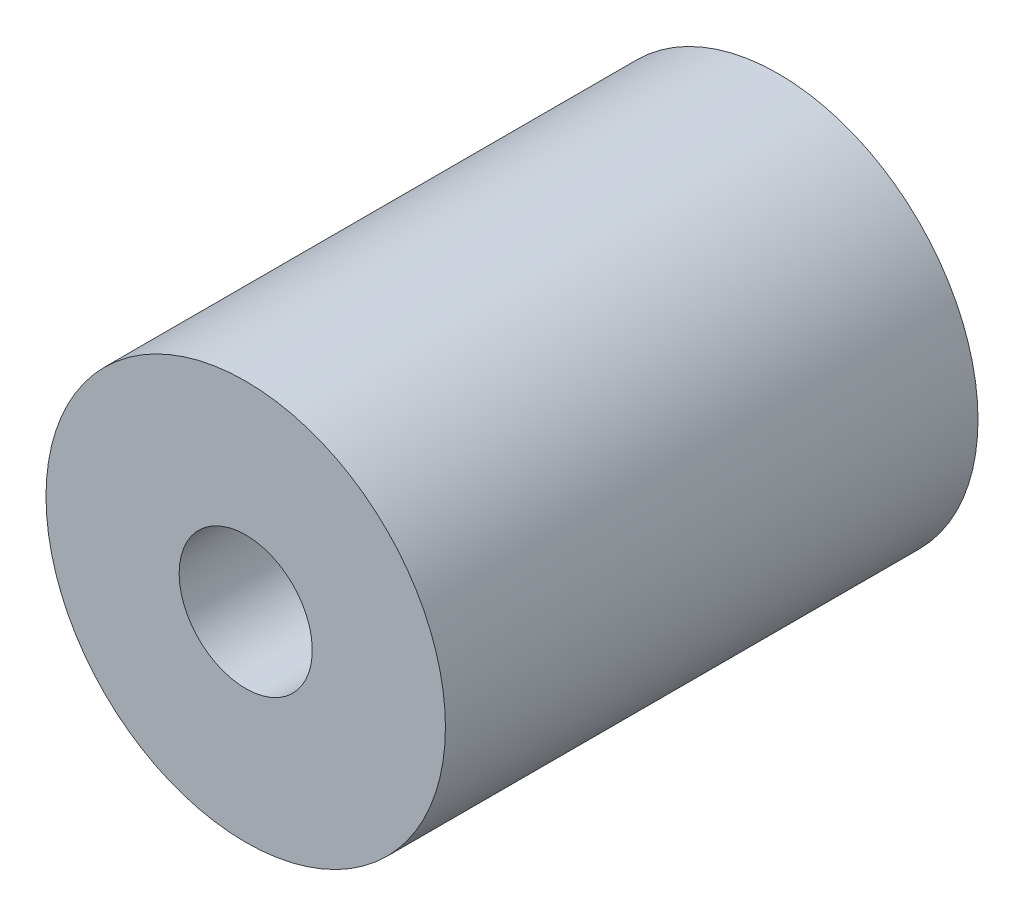
ISO-10303-21;
HEADER;
FILE_DESCRIPTION(('STEP AP214'),'2;1');
FILE_NAME('part.step','',(''),(''),'','','');
FILE_SCHEMA(('AUTOMOTIVE_DESIGN { 1 0 10303 214 1 1 1 1 }'));
ENDSEC;
DATA;
#1=APPLICATION_CONTEXT('core data for automotive mechanical design processes');
#2=APPLICATION_PROTOCOL_DEFINITION('international standard','automotive_design',2000,#1);
#3=PRODUCT_CONTEXT('',#1,'mechanical');
#4=PRODUCT('Part','Part','',(#3));
#5=PRODUCT_RELATED_PRODUCT_CATEGORY('part','',(#4));
#6=PRODUCT_DEFINITION_FORMATION('','',#4);
#7=PRODUCT_DEFINITION_CONTEXT('part definition',#1,'design');
#8=PRODUCT_DEFINITION('design','',#6,#7);
#9=PRODUCT_DEFINITION_SHAPE('','',#8);
#10=(LENGTH_UNIT() NAMED_UNIT(*) SI_UNIT(.MILLI.,.METRE.));
#11=(NAMED_UNIT(*) PLANE_ANGLE_UNIT() SI_UNIT($,.RADIAN.));
#12=(NAMED_UNIT(*) SI_UNIT($,.STERADIAN.) SOLID_ANGLE_UNIT());
#13=UNCERTAINTY_MEASURE_WITH_UNIT(LENGTH_MEASURE(1.E-05),#10,'distance_accuracy_value','');
#14=(GEOMETRIC_REPRESENTATION_CONTEXT(3) GLOBAL_UNCERTAINTY_ASSIGNED_CONTEXT((#13)) GLOBAL_UNIT_ASSIGNED_CONTEXT((#10,
#11,#12)) REPRESENTATION_CONTEXT('',''));
#15=CARTESIAN_POINT('',(0.,0.,0.));
#16=DIRECTION('',(0.,0.,1.));
#17=DIRECTION('',(1.,0.,0.));
#18=AXIS2_PLACEMENT_3D('',#15,#16,#17);
#19=CARTESIAN_POINT('',(0.,0.,0.));
#20=DIRECTION('',(0.,0.,-1.));
#21=DIRECTION('',(-1.,0.,0.));
#22=AXIS2_PLACEMENT_3D('',#19,#20,#21);
#23=CYLINDRICAL_SURFACE('',#22,3.175);
#24=CARTESIAN_POINT('',(0.,-3.175,8.3185));
#25=CARTESIAN_POINT('',(0.100150731503118,-3.17499275067648,8.31849207910339));
#26=CARTESIAN_POINT('',(0.200433092445705,-3.17021088333162,8.3108042187344));
#27=CARTESIAN_POINT('',(0.397932147135805,-3.15153406742592,8.28045884009913));
#28=CARTESIAN_POINT('',(0.495142226239513,-3.13762069640941,8.25777105939043));
#29=CARTESIAN_POINT('',(0.683245756968365,-3.10208297939029,8.19873942088661));
#30=CARTESIAN_POINT('',(0.774167896716103,-3.08049685462858,8.16246320547702));
#31=CARTESIAN_POINT('',(0.948325584690959,-3.03141906457075,8.07773243930584));
#32=CARTESIAN_POINT('',(1.03156218687016,-3.00392821074148,8.02927956178613));
#33=CARTESIAN_POINT('',(1.19544323280342,-2.94275077339973,7.91732998463606));
#34=CARTESIAN_POINT('',(1.27536022154302,-2.90874592332803,7.85294572174966));
#35=CARTESIAN_POINT('',(1.42396857364314,-2.83896006261734,7.7129909650778));
#36=CARTESIAN_POINT('',(1.49264472888179,-2.80317672970002,7.63740557589704));
#37=CARTESIAN_POINT('',(1.62610007343118,-2.72819006674425,7.46542314166307));
#38=CARTESIAN_POINT('',(1.68914985875219,-2.68916382955647,7.36759529650604));
#39=CARTESIAN_POINT('',(1.79771671334379,-2.6178373432717,7.16044482181604));
#40=CARTESIAN_POINT('',(1.84326319705448,-2.58552585233777,7.05114187345));
#41=CARTESIAN_POINT('',(1.90533531422321,-2.53996253725003,6.85256426174961));
#42=CARTESIAN_POINT('',(1.92630377873298,-2.52394969911711,6.76531575525057));
#43=CARTESIAN_POINT('',(1.95616762737068,-2.50088022288992,6.58766574796072));
#44=CARTESIAN_POINT('',(1.965079638091,-2.49381125152602,6.49726876606073));
#45=CARTESIAN_POINT('',(1.97030072013125,-2.48968967186791,6.31564926468328));
#46=CARTESIAN_POINT('',(1.9665785521233,-2.49266189138267,6.22442525596373));
#47=CARTESIAN_POINT('',(1.94671203360093,-2.50820371119212,6.04415173719521));
#48=CARTESIAN_POINT('',(1.93055783866103,-2.52078091723135,5.9551040081381));
#49=CARTESIAN_POINT('',(1.88719799347958,-2.55339303446304,5.78327634811314));
#50=CARTESIAN_POINT('',(1.86022803523469,-2.57326817857472,5.70040482869371));
#51=CARTESIAN_POINT('',(1.79628411541517,-2.61830373216224,5.54018162496283));
#52=CARTESIAN_POINT('',(1.75930659308411,-2.64346602212505,5.46283191775164));
#53=CARTESIAN_POINT('',(1.66855199013727,-2.70184650143587,5.3006760512953));
#54=CARTESIAN_POINT('',(1.61293412678224,-2.7356944781211,5.2171271020967));
#55=CARTESIAN_POINT('',(1.48995441147223,-2.80457471670597,5.05964122456118));
#56=CARTESIAN_POINT('',(1.42258063552865,-2.83960815164733,4.98571418992061));
#57=CARTESIAN_POINT('',(1.26528444000681,-2.91348172238364,4.83755102058363));
#58=CARTESIAN_POINT('',(1.17347940564902,-2.95203698186406,4.76514878793558));
#59=CARTESIAN_POINT('',(0.976740182135971,-3.02283169857784,4.6368935494622));
#60=CARTESIAN_POINT('',(0.87181161679807,-3.0550738460712,4.58103348915768));
#61=CARTESIAN_POINT('',(0.657505934581728,-3.10802031429408,4.49112924293811));
#62=CARTESIAN_POINT('',(0.548710162819909,-3.12927118991461,4.45603550637646));
#63=CARTESIAN_POINT('',(0.325163558119556,-3.16031106025494,4.40517381905607));
#64=CARTESIAN_POINT('',(0.210421112075779,-3.17011576210848,4.38937938323314));
#65=CARTESIAN_POINT('',(-0.00351708167496786,-3.1765339607814,4.37902604821628));
#66=CARTESIAN_POINT('',(-0.102538606232336,-3.17486333540461,4.38170511055687));
#67=CARTESIAN_POINT('',(-0.298489704851634,-3.16246072883334,4.40177279775795));
#68=CARTESIAN_POINT('',(-0.39541939805788,-3.15172926512085,4.41916058257496));
#69=CARTESIAN_POINT('',(-0.581011935254481,-3.12275018502306,4.46684385159697));
#70=CARTESIAN_POINT('',(-0.669846714539016,-3.10478673474038,4.49665267646372));
#71=CARTESIAN_POINT('',(-0.841177035907743,-3.06281468144245,4.56785887929817));
#72=CARTESIAN_POINT('',(-0.923671480115948,-3.03880503454777,4.60925825852006));
#73=CARTESIAN_POINT('',(-1.08908139061996,-2.98376891737546,4.70712206047754));
#74=CARTESIAN_POINT('',(-1.17118630411835,-2.95227714707044,4.76469046568397));
#75=CARTESIAN_POINT('',(-1.32515787173477,-2.88645266248016,4.89093196452131));
#76=CARTESIAN_POINT('',(-1.39701281836218,-2.85211676926098,4.95961756812305));
#77=CARTESIAN_POINT('',(-1.53903730234318,-2.7783556828915,5.1174490361907));
#78=CARTESIAN_POINT('',(-1.60751069551063,-2.73890183464406,5.20811561435647));
#79=CARTESIAN_POINT('',(-1.72846598400683,-2.66422314875433,5.40113604423542));
#80=CARTESIAN_POINT('',(-1.78096023008519,-2.62899505772836,5.50348078499746));
#81=CARTESIAN_POINT('',(-1.85873467641979,-2.57439244045263,5.69545494849947));
#82=CARTESIAN_POINT('',(-1.88742323451887,-2.55324057072337,5.78319082238663));
#83=CARTESIAN_POINT('',(-1.93236955201234,-2.51940006820765,5.96331447767174));
#84=CARTESIAN_POINT('',(-1.94864636724622,-2.5066984655042,6.05569489485506));
#85=CARTESIAN_POINT('',(-1.96786873604926,-2.49164221824267,6.24320837419965));
#86=CARTESIAN_POINT('',(-1.9707437080559,-2.48934235692677,6.33835336048777));
#87=CARTESIAN_POINT('',(-1.9627521290629,-2.49564615813565,6.52771741676862));
#88=CARTESIAN_POINT('',(-1.95188024477099,-2.50425405248525,6.62193611309879));
#89=CARTESIAN_POINT('',(-1.91843218690562,-2.52994770099691,6.79965630780313));
#90=CARTESIAN_POINT('',(-1.89677690473857,-2.54636244357633,6.88343607946556));
#91=CARTESIAN_POINT('',(-1.84329027106412,-2.58534268547129,7.04614373787734));
#92=CARTESIAN_POINT('',(-1.81145480970706,-2.60791066837407,7.12506964970032));
#93=CARTESIAN_POINT('',(-1.73316182091575,-2.66069755278855,7.28835293811224));
#94=CARTESIAN_POINT('',(-1.68524170763365,-2.69155367456549,7.37179959290635));
#95=CARTESIAN_POINT('',(-1.57831386532343,-2.75562036679624,7.53028442985447));
#96=CARTESIAN_POINT('',(-1.5192970587873,-2.78883285089294,7.60531564706884));
#97=CARTESIAN_POINT('',(-1.37867162215544,-2.86134085967127,7.75965624124759));
#98=CARTESIAN_POINT('',(-1.29490093821162,-2.9005851362258,7.83704005515214));
#99=CARTESIAN_POINT('',(-1.11399510187269,-2.97476335447647,7.97699091444611));
#100=CARTESIAN_POINT('',(-1.01685249336506,-3.00969487064223,8.03954964010848));
#101=CARTESIAN_POINT('',(-0.811452165426498,-3.07140725984779,8.147178353817));
#102=CARTESIAN_POINT('',(-0.703257582084788,-3.098231307793,8.19234134624097));
#103=CARTESIAN_POINT('',(-0.535052396768637,-3.13011533497313,8.24530389468037));
#104=CARTESIAN_POINT('',(-0.478056180067238,-3.13934645255851,8.26048688894858));
#105=CARTESIAN_POINT('',(-0.362552032634611,-3.15476808820869,8.28572512387161));
#106=CARTESIAN_POINT('',(-0.304045282045149,-3.16096090861232,8.29578424747771));
#107=CARTESIAN_POINT('',(-0.204530946250925,-3.16866689009058,8.30827277017611));
#108=CARTESIAN_POINT('',(-0.163758556945459,-3.17103725613879,8.31210342338599));
#109=CARTESIAN_POINT('',(-0.0819981441540899,-3.17420534320161,8.31721873753161));
#110=CARTESIAN_POINT('',(-0.0410101076936574,-3.17500296848095,8.31850324347929));
#111=CARTESIAN_POINT('',(0.,-3.175,8.3185));
#112=B_SPLINE_CURVE_WITH_KNOTS('',3,(#24,#25,#26,#27,#28,#29,#30,#31,#32,#33,#34,#35,#36,#37,
#38,#39,#40,#41,#42,#43,#44,#45,#46,#47,#48,#49,#50,#51,#52,#53,#54,#55,#56,#57,#58,#59,#60,#61,
#62,#63,#64,#65,#66,#67,#68,#69,#70,#71,#72,#73,#74,#75,#76,#77,#78,#79,#80,#81,#82,#83,#84,#85,
#86,#87,#88,#89,#90,#91,#92,#93,#94,#95,#96,#97,#98,#99,#100,#101,#102,#103,#104,#105,#106,#107,
#108,#109,#110,#111),.UNSPECIFIED.,.T.,.F.,(4,2,2,2,2,2,2,2,2,2,2,2,2,2,2,2,2,2,2,2,2,2,2,2,2,2,
2,2,2,2,2,2,2,2,2,2,2,2,2,2,2,2,2,4),(0.,0.300286710140589,0.601181107085185,0.900597156722125,
1.19997208492621,1.52305832009855,1.84657812019433,2.2130719473094,2.57894715684157,
2.85125899378972,3.12319491181196,3.39580370913318,3.66862859686845,3.93580589394671,
4.20307837970995,4.51966165134856,4.83656791917787,5.20405451152971,5.57138416124295,
5.918071559533,6.26428265103688,6.55998181861234,6.8556640993787,7.14071335403446,
7.42581185639509,7.73990731250027,8.05435870340572,8.4135749742159,8.77251288711318,
9.05547995710034,9.33801170607062,9.62202975587726,9.90615802842252,10.1693624340595,
10.4326732326282,10.734744554673,11.0370640659319,11.3971944720949,11.7575265046271,
12.1159043978391,12.2947491812654,12.4734582308583,12.5964133065191,12.7193758664227),.UNSPECIFIED.);
#113=CARTESIAN_POINT('',(0.,-3.175,8.3185));
#114=VERTEX_POINT('',#113);
#115=EDGE_CURVE('E56',#114,#114,#112,.T.);
#116=ORIENTED_EDGE('',*,*,#115,.F.);
#117=EDGE_LOOP('',(#116));
#118=FACE_BOUND('',#117,.T.);
#119=CARTESIAN_POINT('',(0.,0.,0.));
#120=DIRECTION('',(0.,0.,-1.));
#121=DIRECTION('',(-1.,0.,0.));
#122=AXIS2_PLACEMENT_3D('',#119,#120,#121);
#123=CIRCLE('',#122,3.175);
#124=CARTESIAN_POINT('',(-3.175,0.,0.));
#125=VERTEX_POINT('',#124);
#126=EDGE_CURVE('E10',#125,#125,#123,.T.);
#127=ORIENTED_EDGE('',*,*,#126,.T.);
#128=EDGE_LOOP('',(#127));
#129=FACE_BOUND('',#128,.T.);
#130=CARTESIAN_POINT('',(0.,0.,12.7));
#131=DIRECTION('',(0.,0.,-1.));
#132=DIRECTION('',(-1.,0.,0.));
#133=AXIS2_PLACEMENT_3D('',#130,#131,#132);
#134=CIRCLE('',#133,3.175);
#135=CARTESIAN_POINT('',(-3.175,0.,12.7));
#136=VERTEX_POINT('',#135);
#137=EDGE_CURVE('E53',#136,#136,#134,.T.);
#138=ORIENTED_EDGE('',*,*,#137,.F.);
#139=EDGE_LOOP('',(#138));
#140=FACE_BOUND('',#139,.T.);
#141=ADVANCED_FACE('F30',(#118,#129,#140),#23,.F.);
#142=CARTESIAN_POINT('',(0.,3.175,0.));
#143=DIRECTION('',(0.,0.,-1.));
#144=DIRECTION('',(-1.,0.,0.));
#145=AXIS2_PLACEMENT_3D('',#142,#143,#144);
#146=PLANE('',#145);
#147=CARTESIAN_POINT('',(0.,0.,0.));
#148=DIRECTION('',(0.,0.,-1.));
#149=DIRECTION('',(-1.,0.,0.));
#150=AXIS2_PLACEMENT_3D('',#147,#148,#149);
#151=CIRCLE('',#150,6.35);
#152=CARTESIAN_POINT('',(-6.35,0.,0.));
#153=VERTEX_POINT('',#152);
#154=EDGE_CURVE('E37',#153,#153,#151,.T.);
#155=ORIENTED_EDGE('',*,*,#154,.T.);
#156=EDGE_LOOP('',(#155));
#157=FACE_BOUND('',#156,.T.);
#158=ORIENTED_EDGE('',*,*,#126,.F.);
#159=EDGE_LOOP('',(#158));
#160=FACE_BOUND('',#159,.T.);
#161=ADVANCED_FACE('F93',(#157,#160),#146,.T.);
#162=CARTESIAN_POINT('',(0.,0.,0.));
#163=DIRECTION('',(0.,0.,-1.));
#164=DIRECTION('',(-1.,0.,0.));
#165=AXIS2_PLACEMENT_3D('',#162,#163,#164);
#166=CYLINDRICAL_SURFACE('',#165,6.35);
#167=CARTESIAN_POINT('',(0.,-6.35,-4.3815));
#168=CARTESIAN_POINT('',(0.107821044743491,-6.34999937816709,-4.38150083091616));
#169=CARTESIAN_POINT('',(0.215650658794823,-6.34722785908136,-4.39038778302254));
#170=CARTESIAN_POINT('',(0.428159190387924,-6.3364430955321,-4.42560940017401));
#171=CARTESIAN_POINT('',(0.532837342738678,-6.32842858861135,-4.45194826747926));
#172=CARTESIAN_POINT('',(0.735947683091817,-6.30803391297581,-4.52110209824926));
#173=CARTESIAN_POINT('',(0.834389179459198,-6.29566044032184,-4.56389179978708));
#174=CARTESIAN_POINT('',(1.02269996351334,-6.26782712960598,-4.66462596392761));
#175=CARTESIAN_POINT('',(1.11256793936923,-6.25236682034422,-4.72257274064893));
#176=CARTESIAN_POINT('',(1.28391707751354,-6.21947608927574,-4.85383364288101));
#177=CARTESIAN_POINT('',(1.3651005366084,-6.20200325667903,-4.92752572808805));
#178=CARTESIAN_POINT('',(1.51417721134385,-6.16730390479951,-5.08738048374542));
#179=CARTESIAN_POINT('',(1.58206800221498,-6.15007743098626,-5.17354542444318));
#180=CARTESIAN_POINT('',(1.70423671463171,-6.11736746127653,-5.35846538407047));
#181=CARTESIAN_POINT('',(1.75814446562437,-6.10193638334374,-5.4574751089092));
#182=CARTESIAN_POINT('',(1.84842101656112,-6.07520143448035,-5.66371064393571));
#183=CARTESIAN_POINT('',(1.88479435311764,-6.06389649619334,-5.77093432062976));
#184=CARTESIAN_POINT('',(1.93788344583443,-6.04713709638984,-5.98719797833416));
#185=CARTESIAN_POINT('',(1.95515075944527,-6.04151890337143,-6.09608952216968));
#186=CARTESIAN_POINT('',(1.97126062608267,-6.03628278518737,-6.31535782218951));
#187=CARTESIAN_POINT('',(1.97010798809143,-6.03666329391249,-6.42573418320707));
#188=CARTESIAN_POINT('',(1.94984243445114,-6.04323694292826,-6.64029225752653));
#189=CARTESIAN_POINT('',(1.93142858985391,-6.04920382587374,-6.74454809544038));
#190=CARTESIAN_POINT('',(1.87829596305551,-6.06591065381133,-6.94841103346196));
#191=CARTESIAN_POINT('',(1.843575473179,-6.07665109869723,-7.04801764548902));
#192=CARTESIAN_POINT('',(1.75831717423433,-6.10186972456538,-7.24142902935803));
#193=CARTESIAN_POINT('',(1.70755839587023,-6.11639959425161,-7.33512936639258));
#194=CARTESIAN_POINT('',(1.59181786034528,-6.14753600233421,-7.51291284059532));
#195=CARTESIAN_POINT('',(1.52683245817721,-6.16414307246242,-7.59699350468303));
#196=CARTESIAN_POINT('',(1.38104457431644,-6.19847238105352,-7.75710565773215));
#197=CARTESIAN_POINT('',(1.299664366257,-6.21621126477014,-7.83260849240612));
#198=CARTESIAN_POINT('',(1.12517657910948,-6.25014932638789,-7.96902259296149));
#199=CARTESIAN_POINT('',(1.03206815936881,-6.26634839377218,-8.02993281196698));
#200=CARTESIAN_POINT('',(0.835759930530548,-6.29554710732219,-8.13578325523116));
#201=CARTESIAN_POINT('',(0.732489107550241,-6.30852162239179,-8.18059917860213));
#202=CARTESIAN_POINT('',(0.519379000816094,-6.32962801486778,-8.25206679153639));
#203=CARTESIAN_POINT('',(0.409541689139818,-6.33776133824273,-8.27872390512224));
#204=CARTESIAN_POINT('',(0.190905224334643,-6.34803707230758,-8.3122208075219));
#205=CARTESIAN_POINT('',(0.0822257471007724,-6.3503957755514,-8.31977642805264));
#206=CARTESIAN_POINT('',(-0.134858899085132,-6.34949515912923,-8.31687173407065));
#207=CARTESIAN_POINT('',(-0.243264105165608,-6.34623664567395,-8.30641400492306));
#208=CARTESIAN_POINT('',(-0.45397394261319,-6.33460974780687,-8.268354997134));
#209=CARTESIAN_POINT('',(-0.556362881360833,-6.32636794189705,-8.24117810535662));
#210=CARTESIAN_POINT('',(-0.755100384936579,-6.30573655833529,-8.17096859193018));
#211=CARTESIAN_POINT('',(-0.851448205728042,-6.29334647095911,-8.12793402168753));
#212=CARTESIAN_POINT('',(-1.03795431054726,-6.2653223902749,-8.02606852934035));
#213=CARTESIAN_POINT('',(-1.12790708282028,-6.24961732131726,-7.966881423706));
#214=CARTESIAN_POINT('',(-1.29684465716827,-6.21676062124935,-7.83481940045427));
#215=CARTESIAN_POINT('',(-1.37582651992963,-6.19960860444523,-7.76194082689036));
#216=CARTESIAN_POINT('',(-1.52377274389715,-6.16495095871025,-7.60119835006452));
#217=CARTESIAN_POINT('',(-1.59222707030603,-6.14745757974898,-7.51286131547883));
#218=CARTESIAN_POINT('',(-1.71338407444713,-6.11479894020443,-7.32557361684218));
#219=CARTESIAN_POINT('',(-1.76608703858373,-6.09963363729258,-7.22662314581802));
#220=CARTESIAN_POINT('',(-1.85391021779371,-6.07351795911794,-7.02114592986478));
#221=CARTESIAN_POINT('',(-1.88910159369447,-6.06255056771885,-6.91465189022843));
#222=CARTESIAN_POINT('',(-1.94093095689538,-6.04615913441233,-6.69684120844226));
#223=CARTESIAN_POINT('',(-1.95757585937024,-6.04073302646391,-6.5855263798488));
#224=CARTESIAN_POINT('',(-1.97134848770619,-6.03625144522611,-6.36655894980418));
#225=CARTESIAN_POINT('',(-1.96931183110177,-6.03692320277268,-6.25896383267988));
#226=CARTESIAN_POINT('',(-1.9477917816748,-6.0439004151366,-6.04572832921572));
#227=CARTESIAN_POINT('',(-1.92830917860438,-6.05020561493633,-5.94008785461304));
#228=CARTESIAN_POINT('',(-1.87300567279289,-6.06755019723964,-5.73522851983885));
#229=CARTESIAN_POINT('',(-1.83742025574854,-6.07852121287907,-5.63593986463017));
#230=CARTESIAN_POINT('',(-1.75110622249468,-6.10394478211428,-5.44466311266713));
#231=CARTESIAN_POINT('',(-1.70037456157209,-6.11839803560014,-5.3526764884852));
#232=CARTESIAN_POINT('',(-1.58291840846821,-6.14985333797402,-5.17477373458348));
#233=CARTESIAN_POINT('',(-1.515652407046,-6.16693220878627,-5.08922873599919));
#234=CARTESIAN_POINT('',(-1.36799427958829,-6.20135715482311,-4.93037002746668));
#235=CARTESIAN_POINT('',(-1.28759866459236,-6.21870329995844,-4.85705957912993));
#236=CARTESIAN_POINT('',(-1.11287245279075,-6.25237305522579,-4.72240854158235));
#237=CARTESIAN_POINT('',(-1.01817872302149,-6.26864629362244,-4.6615251838568));
#238=CARTESIAN_POINT('',(-0.819395712159872,-6.29771038681363,-4.55662341149709));
#239=CARTESIAN_POINT('',(-0.715310290499441,-6.31050266347783,-4.51259810784632));
#240=CARTESIAN_POINT('',(-0.510281620539912,-6.33022578271837,-4.44601260594472));
#241=CARTESIAN_POINT('',(-0.409884893025564,-6.33757736407865,-4.42188922147369));
#242=CARTESIAN_POINT('',(-0.206327697287119,-6.3474643010853,-4.38963407866907));
#243=CARTESIAN_POINT('',(-0.103167771449066,-6.35000059499624,-4.381499204944));
#244=CARTESIAN_POINT('',(0.,-6.35,-4.3815));
#245=B_SPLINE_CURVE_WITH_KNOTS('',3,(#167,#168,#169,#170,#171,#172,#173,#174,#175,#176,#177,
#178,#179,#180,#181,#182,#183,#184,#185,#186,#187,#188,#189,#190,#191,#192,#193,#194,#195,#196,
#197,#198,#199,#200,#201,#202,#203,#204,#205,#206,#207,#208,#209,#210,#211,#212,#213,#214,#215,
#216,#217,#218,#219,#220,#221,#222,#223,#224,#225,#226,#227,#228,#229,#230,#231,#232,#233,#234,
#235,#236,#237,#238,#239,#240,#241,#242,#243,#244),.UNSPECIFIED.,.T.,.F.,(4,2,2,2,2,2,2,2,2,2,2,
2,2,2,2,2,2,2,2,2,2,2,2,2,2,2,2,2,2,2,2,2,2,2,2,2,2,2,4),(0.,0.323083974345125,
0.646245772615618,0.968913292544456,1.2916301047798,1.6231999065249,1.9548301350262,
2.29450503381354,2.63409200257488,2.96359688957897,3.29301575261962,3.60964445729967,
3.92630632757723,4.24753666789992,4.56884940725983,4.90454247849762,5.24025962518785,
5.57851651249499,5.91667231837344,6.24195413385132,6.56718926716218,6.88449127664811,
7.2018322892554,7.5268324691923,7.85191955554946,8.18966937759406,8.52741305801642,
8.86377282642514,9.20000713886924,9.52127782674194,9.84253397190244,10.1592367743897,
10.4760032837059,10.8049910553126,11.1340663922223,11.4736548759616,11.8131044389392,
12.1223052112755,12.4314457292828),.UNSPECIFIED.);
#246=CARTESIAN_POINT('',(0.,-6.35,-4.3815));
#247=VERTEX_POINT('',#246);
#248=EDGE_CURVE('E95',#247,#247,#245,.T.);
#249=ORIENTED_EDGE('',*,*,#248,.F.);
#250=EDGE_LOOP('',(#249));
#251=FACE_BOUND('',#250,.T.);
#252=CARTESIAN_POINT('',(0.,0.,-12.7));
#253=DIRECTION('',(0.,0.,-1.));
#254=DIRECTION('',(-1.,0.,0.));
#255=AXIS2_PLACEMENT_3D('',#252,#253,#254);
#256=CIRCLE('',#255,6.35);
#257=CARTESIAN_POINT('',(-6.35,0.,-12.7));
#258=VERTEX_POINT('',#257);
#259=EDGE_CURVE('E41',#258,#258,#256,.T.);
#260=ORIENTED_EDGE('',*,*,#259,.T.);
#261=EDGE_LOOP('',(#260));
#262=FACE_BOUND('',#261,.T.);
#263=ORIENTED_EDGE('',*,*,#154,.F.);
#264=EDGE_LOOP('',(#263));
#265=FACE_BOUND('',#264,.T.);
#266=ADVANCED_FACE('F89',(#251,#262,#265),#166,.F.);
#267=CARTESIAN_POINT('',(0.,6.35,-12.7));
#268=DIRECTION('',(0.,0.,-1.));
#269=DIRECTION('',(-1.,0.,0.));
#270=AXIS2_PLACEMENT_3D('',#267,#268,#269);
#271=PLANE('',#270);
#272=CARTESIAN_POINT('',(0.,0.,-12.7));
#273=DIRECTION('',(0.,0.,-1.));
#274=DIRECTION('',(-1.,0.,0.));
#275=AXIS2_PLACEMENT_3D('',#272,#273,#274);
#276=CIRCLE('',#275,9.525);
#277=CARTESIAN_POINT('',(-9.525,0.,-12.7));
#278=VERTEX_POINT('',#277);
#279=EDGE_CURVE('E45',#278,#278,#276,.T.);
#280=ORIENTED_EDGE('',*,*,#279,.T.);
#281=EDGE_LOOP('',(#280));
#282=FACE_BOUND('',#281,.T.);
#283=ORIENTED_EDGE('',*,*,#259,.F.);
#284=EDGE_LOOP('',(#283));
#285=FACE_BOUND('',#284,.T.);
#286=ADVANCED_FACE('F85',(#282,#285),#271,.T.);
#287=CARTESIAN_POINT('',(0.,0.,0.));
#288=DIRECTION('',(0.,0.,-1.));
#289=DIRECTION('',(-1.,0.,0.));
#290=AXIS2_PLACEMENT_3D('',#287,#288,#289);
#291=CYLINDRICAL_SURFACE('',#290,9.525);
#292=CARTESIAN_POINT('',(0.,-9.525,-4.3815));
#293=CARTESIAN_POINT('',(0.109325214780728,-9.52499797722318,-4.38150392720202));
#294=CARTESIAN_POINT('',(0.218699298836232,-9.52309854269612,-4.3906382094442));
#295=CARTESIAN_POINT('',(0.434350648157332,-9.5157046184378,-4.42690190158523));
#296=CARTESIAN_POINT('',(0.540625473543395,-9.51020737211297,-4.45404510989332));
#297=CARTESIAN_POINT('',(0.746929638727985,-9.49623105896212,-4.52544809019445));
#298=CARTESIAN_POINT('',(0.846965036417708,-9.48775493912347,-4.56969094987125));
#299=CARTESIAN_POINT('',(1.03818724349356,-9.46874001328564,-4.6739858764017));
#300=CARTESIAN_POINT('',(1.12937447538468,-9.45820130584877,-4.73403718788379));
#301=CARTESIAN_POINT('',(1.30163189165895,-9.43604939541512,-4.86916139819179));
#302=CARTESIAN_POINT('',(1.38255621248373,-9.4244240736427,-4.94441827590747));
#303=CARTESIAN_POINT('',(1.53072703086181,-9.40149637536172,-5.10742203399566));
#304=CARTESIAN_POINT('',(1.5979724096106,-9.39019402533403,-5.19516993501557));
#305=CARTESIAN_POINT('',(1.71750521844225,-9.36907324988776,-5.38172427144989));
#306=CARTESIAN_POINT('',(1.76964014048047,-9.3592703960289,-5.48063034430947));
#307=CARTESIAN_POINT('',(1.85649467132889,-9.34243130041478,-5.68603494751079));
#308=CARTESIAN_POINT('',(1.89121612459548,-9.33539476566461,-5.79253267236989));
#309=CARTESIAN_POINT('',(1.94178160183454,-9.3250079195152,-6.00852357721153));
#310=CARTESIAN_POINT('',(1.95788236741264,-9.32160752376978,-6.11795419310448));
#311=CARTESIAN_POINT('',(1.97154718649839,-9.31872732903828,-6.33801224069791));
#312=CARTESIAN_POINT('',(1.9691132670383,-9.31924710132583,-6.44863954020256));
#313=CARTESIAN_POINT('',(1.94598504840487,-9.32410306524923,-6.66606187355753));
#314=CARTESIAN_POINT('',(1.92558641761805,-9.32837745929926,-6.77288994621779));
#315=CARTESIAN_POINT('',(1.86757511730737,-9.34016360825919,-6.98157416893835));
#316=CARTESIAN_POINT('',(1.8299615756207,-9.3476755271914,-7.08343006680288));
#317=CARTESIAN_POINT('',(1.73830961572463,-9.36515271052627,-7.28012345664611));
#318=CARTESIAN_POINT('',(1.68415522328721,-9.37513520013501,-7.37490531480019));
#319=CARTESIAN_POINT('',(1.56104053450099,-9.39641786552147,-7.55414683675996));
#320=CARTESIAN_POINT('',(1.49207842632082,-9.40771820247001,-7.63860523542928));
#321=CARTESIAN_POINT('',(1.3397290414665,-9.43063013542355,-7.79650715205593));
#322=CARTESIAN_POINT('',(1.25608973236155,-9.44224353670682,-7.8697074543594));
#323=CARTESIAN_POINT('',(1.0775944791829,-9.46427433422189,-8.00107904125835));
#324=CARTESIAN_POINT('',(0.982738371967517,-9.4746917130539,-8.05925010722328));
#325=CARTESIAN_POINT('',(0.784222745676315,-9.49318503674092,-8.15896214315682));
#326=CARTESIAN_POINT('',(0.680548147507974,-9.50125686239469,-8.20047390459809));
#327=CARTESIAN_POINT('',(0.467492111943824,-9.51411858928005,-8.26542207958042));
#328=CARTESIAN_POINT('',(0.358111415605513,-9.51890891554746,-8.28886083407504));
#329=CARTESIAN_POINT('',(0.138836813209462,-9.52460825821475,-8.31665006292681));
#330=CARTESIAN_POINT('',(0.0289867671589364,-9.52558490197956,-8.32133316674243));
#331=CARTESIAN_POINT('',(-0.18992607376465,-9.52373525753701,-8.31237596583818));
#332=CARTESIAN_POINT('',(-0.298988915639572,-9.52090919829918,-8.29873676434668));
#333=CARTESIAN_POINT('',(-0.512148314298207,-9.5118141298657,-8.25379830555904));
#334=CARTESIAN_POINT('',(-0.61628268713774,-9.5055786665379,-8.2226710363293));
#335=CARTESIAN_POINT('',(-0.817853472166443,-9.49036178083389,-8.14382899462292));
#336=CARTESIAN_POINT('',(-0.915289357016742,-9.4813801425674,-8.09611291797841));
#337=CARTESIAN_POINT('',(-1.10209069136893,-9.46149924438683,-7.9847373760062));
#338=CARTESIAN_POINT('',(-1.19133520278028,-9.45057664388468,-7.92087932692054));
#339=CARTESIAN_POINT('',(-1.3579611009551,-9.42807766096255,-7.77929689396398));
#340=CARTESIAN_POINT('',(-1.43534112133219,-9.41650120345021,-7.70157091520554));
#341=CARTESIAN_POINT('',(-1.57733620167181,-9.3937693184835,-7.53294037225697));
#342=CARTESIAN_POINT('',(-1.64172219823569,-9.38262385231623,-7.44184134504517));
#343=CARTESIAN_POINT('',(-1.75427993978499,-9.36223329538877,-7.24992633184708));
#344=CARTESIAN_POINT('',(-1.80245235491304,-9.35298812609134,-7.14911074768886));
#345=CARTESIAN_POINT('',(-1.88090961040677,-9.33752670256865,-6.94114606916686));
#346=CARTESIAN_POINT('',(-1.91129028146396,-9.33129425343324,-6.83403439029193));
#347=CARTESIAN_POINT('',(-1.95358915109126,-9.32253127940933,-6.61608291578764));
#348=CARTESIAN_POINT('',(-1.96550994288242,-9.32000023455491,-6.5052436460412));
#349=CARTESIAN_POINT('',(-1.97044964547399,-9.31895687701793,-6.28528638885932));
#350=CARTESIAN_POINT('',(-1.96383091674554,-9.32036752151867,-6.1761767450724));
#351=CARTESIAN_POINT('',(-1.93268278189076,-9.32687573391707,-5.96066253510406));
#352=CARTESIAN_POINT('',(-1.90815354183695,-9.33197326762861,-5.85425794384991));
#353=CARTESIAN_POINT('',(-1.84204706223161,-9.34524535546759,-5.64742469130282));
#354=CARTESIAN_POINT('',(-1.80051714162707,-9.35341136380084,-5.5469803220268));
#355=CARTESIAN_POINT('',(-1.70163099091131,-9.37190461402269,-5.35442926927143));
#356=CARTESIAN_POINT('',(-1.64427332015879,-9.38223205262391,-5.26232334577112));
#357=CARTESIAN_POINT('',(-1.51413459149824,-9.40411832283064,-5.08726556516286));
#358=CARTESIAN_POINT('',(-1.44109302049258,-9.41569606831887,-5.00450970317614));
#359=CARTESIAN_POINT('',(-1.28219439498359,-9.43864575649097,-4.85230992034833));
#360=CARTESIAN_POINT('',(-1.1963343954097,-9.45001765120506,-4.78286906706576));
#361=CARTESIAN_POINT('',(-1.01306756229291,-9.47142637051746,-4.65852485474281));
#362=CARTESIAN_POINT('',(-0.915541089804445,-9.48144663632648,-4.60379484286695));
#363=CARTESIAN_POINT('',(-0.712492370235797,-9.49885913379913,-4.51158856898896));
#364=CARTESIAN_POINT('',(-0.606977253716623,-9.50625367636716,-4.47409712667259));
#365=CARTESIAN_POINT('',(-0.417724142635669,-9.51618529088229,-4.42449412674331));
#366=CARTESIAN_POINT('',(-0.335045862669026,-9.51947107568614,-4.40840076111168));
#367=CARTESIAN_POINT('',(-0.168254670086087,-9.52387916984359,-4.3869023782126));
#368=CARTESIAN_POINT('',(-0.0841418090544403,-9.52500155682385,-4.38149697744127));
#369=CARTESIAN_POINT('',(0.,-9.525,-4.3815));
#370=B_SPLINE_CURVE_WITH_KNOTS('',3,(#292,#293,#294,#295,#296,#297,#298,#299,#300,#301,#302,
#303,#304,#305,#306,#307,#308,#309,#310,#311,#312,#313,#314,#315,#316,#317,#318,#319,#320,#321,
#322,#323,#324,#325,#326,#327,#328,#329,#330,#331,#332,#333,#334,#335,#336,#337,#338,#339,#340,
#341,#342,#343,#344,#345,#346,#347,#348,#349,#350,#351,#352,#353,#354,#355,#356,#357,#358,#359,
#360,#361,#362,#363,#364,#365,#366,#367,#368,#369),.UNSPECIFIED.,.T.,.F.,(4,2,2,2,2,2,2,2,2,2,2,
2,2,2,2,2,2,2,2,2,2,2,2,2,2,2,2,2,2,2,2,2,2,2,2,2,2,2,4),(0.,0.327667768179968,
0.655586885235371,0.983182502234619,1.31076246864947,1.64257292317095,1.97441050566017,
2.30948912409696,2.64453224308766,2.97489854806906,3.30522872330021,3.6302217528073,
3.95523124933027,4.28257395972369,4.60995674571746,4.94363894433683,5.27732599676314,
5.61159556854535,5.9458218359094,6.27409366814787,6.60234573526607,6.9274247048188,
7.25252923699617,7.58184650293844,7.91120166660335,8.2459346993441,8.58065389514007,
8.91355322323134,9.24640578179243,9.57279828419322,9.89918776020729,10.2246748890444,
10.5501916534867,10.8816037039026,11.2130920146962,11.54833039464,11.8832729950219,
12.1354705157375,12.3876589869771),.UNSPECIFIED.);
#371=CARTESIAN_POINT('',(0.,-9.525,-4.3815));
#372=VERTEX_POINT('',#371);
#373=EDGE_CURVE('E100',#372,#372,#370,.T.);
#374=ORIENTED_EDGE('',*,*,#373,.T.);
#375=EDGE_LOOP('',(#374));
#376=FACE_BOUND('',#375,.T.);
#377=CARTESIAN_POINT('',(0.,-9.525,8.3185));
#378=CARTESIAN_POINT('',(0.109325214780728,-9.52499797722318,8.31849607279798));
#379=CARTESIAN_POINT('',(0.218699298836232,-9.52309854269612,8.3093617905558));
#380=CARTESIAN_POINT('',(0.434350648157332,-9.5157046184378,8.27309809841476));
#381=CARTESIAN_POINT('',(0.540625473543395,-9.51020737211297,8.24595489010668));
#382=CARTESIAN_POINT('',(0.746929638727985,-9.49623105896212,8.17455190980555));
#383=CARTESIAN_POINT('',(0.846965036417709,-9.48775493912347,8.13030905012875));
#384=CARTESIAN_POINT('',(1.03818724349356,-9.46874001328564,8.0260141235983));
#385=CARTESIAN_POINT('',(1.12937447538468,-9.45820130584877,7.9659628121162));
#386=CARTESIAN_POINT('',(1.30163189165895,-9.43604939541512,7.83083860180821));
#387=CARTESIAN_POINT('',(1.38255621248373,-9.4244240736427,7.75558172409253));
#388=CARTESIAN_POINT('',(1.53072703086181,-9.40149637536172,7.59257796600434));
#389=CARTESIAN_POINT('',(1.5979724096106,-9.39019402533403,7.50483006498443));
#390=CARTESIAN_POINT('',(1.71750521844225,-9.36907324988776,7.31827572855011));
#391=CARTESIAN_POINT('',(1.76964014048046,-9.3592703960289,7.21936965569054));
#392=CARTESIAN_POINT('',(1.85649467132888,-9.34243130041478,7.01396505248921));
#393=CARTESIAN_POINT('',(1.89121612459547,-9.33539476566461,6.90746732763011));
#394=CARTESIAN_POINT('',(1.94178160183454,-9.3250079195152,6.69147642278847));
#395=CARTESIAN_POINT('',(1.95788236741264,-9.32160752376978,6.58204580689552));
#396=CARTESIAN_POINT('',(1.97154718649839,-9.31872732903828,6.3619877593021));
#397=CARTESIAN_POINT('',(1.9691132670383,-9.31924710132583,6.25136045979744));
#398=CARTESIAN_POINT('',(1.94598504840487,-9.32410306524923,6.03393812644247));
#399=CARTESIAN_POINT('',(1.92558641761805,-9.32837745929926,5.92711005378221));
#400=CARTESIAN_POINT('',(1.86757511730737,-9.34016360825919,5.71842583106165));
#401=CARTESIAN_POINT('',(1.8299615756207,-9.3476755271914,5.61656993319712));
#402=CARTESIAN_POINT('',(1.73830961572463,-9.36515271052627,5.41987654335389));
#403=CARTESIAN_POINT('',(1.68415522328721,-9.37513520013501,5.32509468519981));
#404=CARTESIAN_POINT('',(1.56104053450099,-9.39641786552147,5.14585316324004));
#405=CARTESIAN_POINT('',(1.49207842632082,-9.40771820247001,5.06139476457072));
#406=CARTESIAN_POINT('',(1.3397290414665,-9.43063013542355,4.90349284794407));
#407=CARTESIAN_POINT('',(1.25608973236155,-9.44224353670682,4.8302925456406));
#408=CARTESIAN_POINT('',(1.0775944791829,-9.46427433422189,4.69892095874165));
#409=CARTESIAN_POINT('',(0.982738371967517,-9.4746917130539,4.64074989277672));
#410=CARTESIAN_POINT('',(0.784222745676315,-9.49318503674092,4.54103785684318));
#411=CARTESIAN_POINT('',(0.680548147507975,-9.50125686239469,4.49952609540191));
#412=CARTESIAN_POINT('',(0.467492111943824,-9.51411858928005,4.43457792041957));
#413=CARTESIAN_POINT('',(0.358111415605514,-9.51890891554746,4.41113916592496));
#414=CARTESIAN_POINT('',(0.138836813209463,-9.52460825821475,4.38334993707319));
#415=CARTESIAN_POINT('',(0.0289867671589374,-9.52558490197956,4.37866683325757));
#416=CARTESIAN_POINT('',(-0.189926073764649,-9.52373525753701,4.38762403416182));
#417=CARTESIAN_POINT('',(-0.298988915639571,-9.52090919829918,4.40126323565332));
#418=CARTESIAN_POINT('',(-0.512148314298206,-9.5118141298657,4.44620169444096));
#419=CARTESIAN_POINT('',(-0.61628268713774,-9.5055786665379,4.4773289636707));
#420=CARTESIAN_POINT('',(-0.817853472166442,-9.49036178083389,4.55617100537708));
#421=CARTESIAN_POINT('',(-0.915289357016741,-9.4813801425674,4.60388708202159));
#422=CARTESIAN_POINT('',(-1.10209069136893,-9.46149924438683,4.71526262399379));
#423=CARTESIAN_POINT('',(-1.19133520278028,-9.45057664388468,4.77912067307946));
#424=CARTESIAN_POINT('',(-1.3579611009551,-9.42807766096255,4.92070310603602));
#425=CARTESIAN_POINT('',(-1.43534112133219,-9.41650120345021,4.99842908479446));
#426=CARTESIAN_POINT('',(-1.57733620167181,-9.3937693184835,5.16705962774302));
#427=CARTESIAN_POINT('',(-1.64172219823569,-9.38262385231623,5.25815865495483));
#428=CARTESIAN_POINT('',(-1.75427993978499,-9.36223329538877,5.45007366815292));
#429=CARTESIAN_POINT('',(-1.80245235491304,-9.35298812609134,5.55088925231114));
#430=CARTESIAN_POINT('',(-1.88090961040677,-9.33752670256865,5.75885393083314));
#431=CARTESIAN_POINT('',(-1.91129028146396,-9.33129425343324,5.86596560970807));
#432=CARTESIAN_POINT('',(-1.95358915109126,-9.32253127940933,6.08391708421236));
#433=CARTESIAN_POINT('',(-1.96550994288242,-9.32000023455491,6.1947563539588));
#434=CARTESIAN_POINT('',(-1.97044964547399,-9.31895687701793,6.41471361114067));
#435=CARTESIAN_POINT('',(-1.96383091674554,-9.32036752151867,6.5238232549276));
#436=CARTESIAN_POINT('',(-1.93268278189076,-9.32687573391707,6.73933746489594));
#437=CARTESIAN_POINT('',(-1.90815354183695,-9.33197326762861,6.84574205615008));
#438=CARTESIAN_POINT('',(-1.84204706223161,-9.34524535546759,7.05257530869717));
#439=CARTESIAN_POINT('',(-1.80051714162707,-9.35341136380084,7.1530196779732));
#440=CARTESIAN_POINT('',(-1.70163099091131,-9.37190461402269,7.34557073072857));
#441=CARTESIAN_POINT('',(-1.6442733201588,-9.38223205262391,7.43767665422888));
#442=CARTESIAN_POINT('',(-1.51413459149824,-9.40411832283064,7.61273443483714));
#443=CARTESIAN_POINT('',(-1.44109302049258,-9.41569606831887,7.69549029682385));
#444=CARTESIAN_POINT('',(-1.28219439498359,-9.43864575649097,7.84769007965167));
#445=CARTESIAN_POINT('',(-1.1963343954097,-9.45001765120506,7.91713093293423));
#446=CARTESIAN_POINT('',(-1.01306756229291,-9.47142637051746,8.04147514525719));
#447=CARTESIAN_POINT('',(-0.915541089804446,-9.48144663632648,8.09620515713305));
#448=CARTESIAN_POINT('',(-0.712492370235798,-9.49885913379913,8.18841143101104));
#449=CARTESIAN_POINT('',(-0.606977253716624,-9.50625367636716,8.2259028733274));
#450=CARTESIAN_POINT('',(-0.41772414263567,-9.51618529088229,8.27550587325669));
#451=CARTESIAN_POINT('',(-0.335045862669028,-9.51947107568614,8.29159923888832));
#452=CARTESIAN_POINT('',(-0.168254670086088,-9.52387916984359,8.3130976217874));
#453=CARTESIAN_POINT('',(-0.0841418090544408,-9.52500155682385,8.31850302255873));
#454=CARTESIAN_POINT('',(0.,-9.525,8.3185));
#455=B_SPLINE_CURVE_WITH_KNOTS('',3,(#377,#378,#379,#380,#381,#382,#383,#384,#385,#386,#387,
#388,#389,#390,#391,#392,#393,#394,#395,#396,#397,#398,#399,#400,#401,#402,#403,#404,#405,#406,
#407,#408,#409,#410,#411,#412,#413,#414,#415,#416,#417,#418,#419,#420,#421,#422,#423,#424,#425,
#426,#427,#428,#429,#430,#431,#432,#433,#434,#435,#436,#437,#438,#439,#440,#441,#442,#443,#444,
#445,#446,#447,#448,#449,#450,#451,#452,#453,#454),.UNSPECIFIED.,.T.,.F.,(4,2,2,2,2,2,2,2,2,2,2,
2,2,2,2,2,2,2,2,2,2,2,2,2,2,2,2,2,2,2,2,2,2,2,2,2,2,2,4),(0.,0.327667768179968,0.65558688523537,
0.98318250223462,1.31076246864947,1.64257292317095,1.97441050566017,2.30948912409696,
2.64453224308766,2.97489854806906,3.30522872330021,3.6302217528073,3.95523124933027,
4.28257395972369,4.60995674571746,4.94363894433683,5.27732599676314,5.61159556854535,
5.94582183590939,6.27409366814787,6.60234573526607,6.9274247048188,7.25252923699617,
7.58184650293843,7.91120166660335,8.2459346993441,8.58065389514007,8.91355322323134,
9.24640578179243,9.57279828419322,9.89918776020729,10.2246748890444,10.5501916534867,
10.8816037039026,11.2130920146962,11.54833039464,11.8832729950219,12.1354705157374,
12.3876589869771),.UNSPECIFIED.);
#456=CARTESIAN_POINT('',(0.,-9.525,8.3185));
#457=VERTEX_POINT('',#456);
#458=EDGE_CURVE('E62',#457,#457,#455,.T.);
#459=ORIENTED_EDGE('',*,*,#458,.T.);
#460=EDGE_LOOP('',(#459));
#461=FACE_BOUND('',#460,.T.);
#462=CARTESIAN_POINT('',(0.,0.,12.7));
#463=DIRECTION('',(0.,0.,-1.));
#464=DIRECTION('',(-1.,0.,0.));
#465=AXIS2_PLACEMENT_3D('',#462,#463,#464);
#466=CIRCLE('',#465,9.525);
#467=CARTESIAN_POINT('',(-9.525,0.,12.7));
#468=VERTEX_POINT('',#467);
#469=EDGE_CURVE('E50',#468,#468,#466,.T.);
#470=ORIENTED_EDGE('',*,*,#469,.T.);
#471=EDGE_LOOP('',(#470));
#472=FACE_BOUND('',#471,.T.);
#473=ORIENTED_EDGE('',*,*,#279,.F.);
#474=EDGE_LOOP('',(#473));
#475=FACE_BOUND('',#474,.T.);
#476=ADVANCED_FACE('F81',(#376,#461,#472,#475),#291,.T.);
#477=CARTESIAN_POINT('',(0.,9.525,12.7));
#478=DIRECTION('',(0.,0.,1.));
#479=DIRECTION('',(1.,0.,0.));
#480=AXIS2_PLACEMENT_3D('',#477,#478,#479);
#481=PLANE('',#480);
#482=ORIENTED_EDGE('',*,*,#137,.T.);
#483=EDGE_LOOP('',(#482));
#484=FACE_BOUND('',#483,.T.);
#485=ORIENTED_EDGE('',*,*,#469,.F.);
#486=EDGE_LOOP('',(#485));
#487=FACE_BOUND('',#486,.T.);
#488=ADVANCED_FACE('F72',(#484,#487),#481,.T.);
#489=CARTESIAN_POINT('',(0.,-9.526,6.35));
#490=DIRECTION('',(0.,1.,0.));
#491=DIRECTION('',(0.,0.,1.));
#492=AXIS2_PLACEMENT_3D('',#489,#490,#491);
#493=CYLINDRICAL_SURFACE('',#492,1.9685);
#494=ORIENTED_EDGE('',*,*,#115,.T.);
#495=EDGE_LOOP('',(#494));
#496=FACE_BOUND('',#495,.T.);
#497=ORIENTED_EDGE('',*,*,#458,.F.);
#498=EDGE_LOOP('',(#497));
#499=FACE_BOUND('',#498,.T.);
#500=ADVANCED_FACE('F67',(#496,#499),#493,.F.);
#501=CARTESIAN_POINT('',(0.,-9.526,-6.35));
#502=DIRECTION('',(0.,1.,0.));
#503=DIRECTION('',(0.,0.,1.));
#504=AXIS2_PLACEMENT_3D('',#501,#502,#503);
#505=CYLINDRICAL_SURFACE('',#504,1.9685);
#506=ORIENTED_EDGE('',*,*,#248,.T.);
#507=EDGE_LOOP('',(#506));
#508=FACE_BOUND('',#507,.T.);
#509=ORIENTED_EDGE('',*,*,#373,.F.);
#510=EDGE_LOOP('',(#509));
#511=FACE_BOUND('',#510,.T.);
#512=ADVANCED_FACE('F71',(#508,#511),#505,.F.);
#513=CLOSED_SHELL('',(#141,#161,#266,#286,#476,#488,#500,#512));
#514=MANIFOLD_SOLID_BREP('B2',#513);
#515=ADVANCED_BREP_SHAPE_REPRESENTATION('',(#18,#514),#14);
#516=SHAPE_DEFINITION_REPRESENTATION(#9,#515);
ENDSEC;
END-ISO-10303-21;
